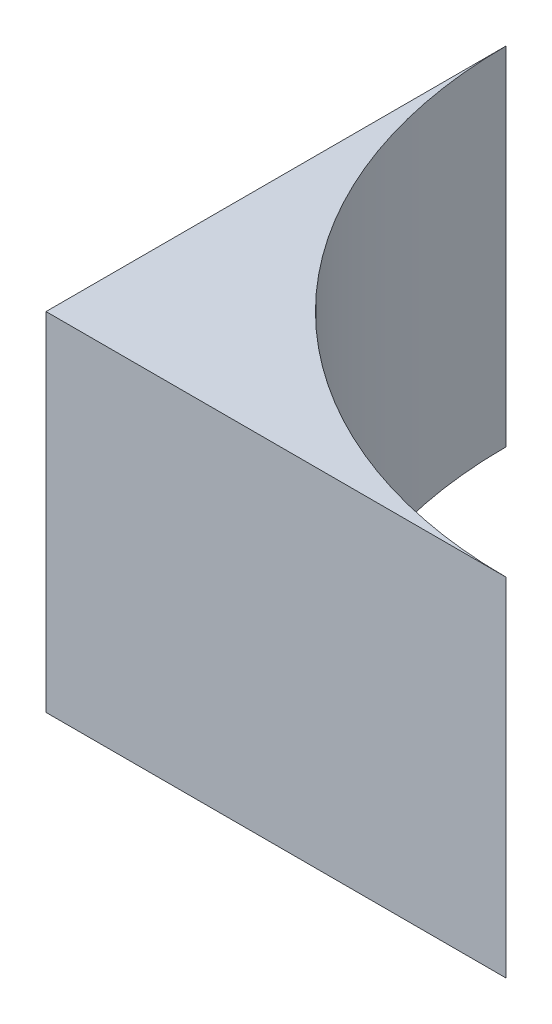
ISO-10303-21;
HEADER;
FILE_DESCRIPTION(('STEP AP214'),'2;1');
FILE_NAME('part.step','',(''),(''),'','','');
FILE_SCHEMA(('AUTOMOTIVE_DESIGN { 1 0 10303 214 1 1 1 1 }'));
ENDSEC;
DATA;
#1=APPLICATION_CONTEXT('core data for automotive mechanical design processes');
#2=APPLICATION_PROTOCOL_DEFINITION('international standard','automotive_design',2000,#1);
#3=PRODUCT_CONTEXT('',#1,'mechanical');
#4=PRODUCT('Part','Part','',(#3));
#5=PRODUCT_RELATED_PRODUCT_CATEGORY('part','',(#4));
#6=PRODUCT_DEFINITION_FORMATION('','',#4);
#7=PRODUCT_DEFINITION_CONTEXT('part definition',#1,'design');
#8=PRODUCT_DEFINITION('design','',#6,#7);
#9=PRODUCT_DEFINITION_SHAPE('','',#8);
#10=(LENGTH_UNIT() NAMED_UNIT(*) SI_UNIT(.MILLI.,.METRE.));
#11=(NAMED_UNIT(*) PLANE_ANGLE_UNIT() SI_UNIT($,.RADIAN.));
#12=(NAMED_UNIT(*) SI_UNIT($,.STERADIAN.) SOLID_ANGLE_UNIT());
#13=UNCERTAINTY_MEASURE_WITH_UNIT(LENGTH_MEASURE(1.E-05),#10,'distance_accuracy_value','');
#14=(GEOMETRIC_REPRESENTATION_CONTEXT(3) GLOBAL_UNCERTAINTY_ASSIGNED_CONTEXT((#13)) GLOBAL_UNIT_ASSIGNED_CONTEXT((#10,
#11,#12)) REPRESENTATION_CONTEXT('',''));
#15=CARTESIAN_POINT('',(0.,0.,0.));
#16=DIRECTION('',(0.,0.,1.));
#17=DIRECTION('',(1.,0.,0.));
#18=AXIS2_PLACEMENT_3D('',#15,#16,#17);
#19=CARTESIAN_POINT('',(0.,48.5,0.));
#20=DIRECTION('',(0.,-1.,0.));
#21=DIRECTION('',(0.,0.,-1.));
#22=AXIS2_PLACEMENT_3D('',#19,#20,#21);
#23=CYLINDRICAL_SURFACE('',#22,64.25);
#24=CARTESIAN_POINT('',(0.,0.,0.));
#25=DIRECTION('',(0.,-1.,0.));
#26=DIRECTION('',(0.,0.,1.));
#27=AXIS2_PLACEMENT_3D('',#24,#25,#26);
#28=CIRCLE('',#27,64.25);
#29=CARTESIAN_POINT('',(0.,0.,64.25));
#30=VERTEX_POINT('',#29);
#31=CARTESIAN_POINT('',(-64.25,0.,0.));
#32=VERTEX_POINT('',#31);
#33=EDGE_CURVE('E86',#30,#32,#28,.T.);
#34=ORIENTED_EDGE('',*,*,#33,.T.);
#35=DIRECTION('',(0.,-1.,0.));
#36=VECTOR('',#35,1.);
#37=CARTESIAN_POINT('',(-64.25,48.5,0.));
#38=LINE('',#37,#36);
#39=CARTESIAN_POINT('',(-64.25,48.5,0.));
#40=VERTEX_POINT('',#39);
#41=EDGE_CURVE('E11',#40,#32,#38,.T.);
#42=ORIENTED_EDGE('',*,*,#41,.F.);
#43=CARTESIAN_POINT('',(0.,48.5,0.));
#44=DIRECTION('',(0.,-1.,0.));
#45=DIRECTION('',(0.,0.,1.));
#46=AXIS2_PLACEMENT_3D('',#43,#44,#45);
#47=CIRCLE('',#46,64.25);
#48=CARTESIAN_POINT('',(0.,48.5,64.25));
#49=VERTEX_POINT('',#48);
#50=EDGE_CURVE('E79',#49,#40,#47,.T.);
#51=ORIENTED_EDGE('',*,*,#50,.F.);
#52=DIRECTION('',(0.,-1.,0.));
#53=VECTOR('',#52,1.);
#54=CARTESIAN_POINT('',(0.,48.5,64.25));
#55=LINE('',#54,#53);
#56=EDGE_CURVE('E87',#49,#30,#55,.T.);
#57=ORIENTED_EDGE('',*,*,#56,.T.);
#58=EDGE_LOOP('',(#34,#42,#51,#57));
#59=FACE_BOUND('',#58,.T.);
#60=ADVANCED_FACE('F39',(#59),#23,.F.);
#61=CARTESIAN_POINT('',(-64.25,48.5,64.25));
#62=DIRECTION('',(1.,0.,0.));
#63=DIRECTION('',(0.,0.,-1.));
#64=AXIS2_PLACEMENT_3D('',#61,#62,#63);
#65=PLANE('',#64);
#66=DIRECTION('',(0.,0.,1.));
#67=VECTOR('',#66,1.);
#68=CARTESIAN_POINT('',(-64.25,0.,64.25));
#69=LINE('',#68,#67);
#70=CARTESIAN_POINT('',(-64.25,0.,64.25));
#71=VERTEX_POINT('',#70);
#72=EDGE_CURVE('E67',#32,#71,#69,.T.);
#73=ORIENTED_EDGE('',*,*,#72,.T.);
#74=DIRECTION('',(0.,-1.,0.));
#75=VECTOR('',#74,1.);
#76=CARTESIAN_POINT('',(-64.25,48.5,64.25));
#77=LINE('',#76,#75);
#78=CARTESIAN_POINT('',(-64.25,48.5,64.25));
#79=VERTEX_POINT('',#78);
#80=EDGE_CURVE('E47',#79,#71,#77,.T.);
#81=ORIENTED_EDGE('',*,*,#80,.F.);
#82=DIRECTION('',(0.,0.,1.));
#83=VECTOR('',#82,1.);
#84=CARTESIAN_POINT('',(-64.25,48.5,64.25));
#85=LINE('',#84,#83);
#86=EDGE_CURVE('E75',#40,#79,#85,.T.);
#87=ORIENTED_EDGE('',*,*,#86,.F.);
#88=ORIENTED_EDGE('',*,*,#41,.T.);
#89=EDGE_LOOP('',(#73,#81,#87,#88));
#90=FACE_BOUND('',#89,.T.);
#91=ADVANCED_FACE('F76',(#90),#65,.F.);
#92=CARTESIAN_POINT('',(0.,48.5,64.25));
#93=DIRECTION('',(0.,0.,-1.));
#94=DIRECTION('',(-1.,0.,0.));
#95=AXIS2_PLACEMENT_3D('',#92,#93,#94);
#96=PLANE('',#95);
#97=DIRECTION('',(1.,0.,0.));
#98=VECTOR('',#97,1.);
#99=CARTESIAN_POINT('',(0.,0.,64.25));
#100=LINE('',#99,#98);
#101=EDGE_CURVE('E72',#71,#30,#100,.T.);
#102=ORIENTED_EDGE('',*,*,#101,.T.);
#103=ORIENTED_EDGE('',*,*,#56,.F.);
#104=DIRECTION('',(1.,0.,0.));
#105=VECTOR('',#104,1.);
#106=CARTESIAN_POINT('',(0.,48.5,64.25));
#107=LINE('',#106,#105);
#108=EDGE_CURVE('E55',#79,#49,#107,.T.);
#109=ORIENTED_EDGE('',*,*,#108,.F.);
#110=ORIENTED_EDGE('',*,*,#80,.T.);
#111=EDGE_LOOP('',(#102,#103,#109,#110));
#112=FACE_BOUND('',#111,.T.);
#113=ADVANCED_FACE('F94',(#112),#96,.F.);
#114=CARTESIAN_POINT('',(0.,48.5,0.));
#115=DIRECTION('',(0.,1.,0.));
#116=DIRECTION('',(0.,0.,1.));
#117=AXIS2_PLACEMENT_3D('',#114,#115,#116);
#118=PLANE('',#117);
#119=ORIENTED_EDGE('',*,*,#50,.T.);
#120=ORIENTED_EDGE('',*,*,#86,.T.);
#121=ORIENTED_EDGE('',*,*,#108,.T.);
#122=EDGE_LOOP('',(#119,#120,#121));
#123=FACE_BOUND('',#122,.T.);
#124=ADVANCED_FACE('F82',(#123),#118,.T.);
#125=CARTESIAN_POINT('',(0.,0.,0.));
#126=DIRECTION('',(0.,1.,0.));
#127=DIRECTION('',(0.,0.,1.));
#128=AXIS2_PLACEMENT_3D('',#125,#126,#127);
#129=PLANE('',#128);
#130=ORIENTED_EDGE('',*,*,#33,.F.);
#131=ORIENTED_EDGE('',*,*,#101,.F.);
#132=ORIENTED_EDGE('',*,*,#72,.F.);
#133=EDGE_LOOP('',(#130,#131,#132));
#134=FACE_BOUND('',#133,.T.);
#135=ADVANCED_FACE('F95',(#134),#129,.F.);
#136=CLOSED_SHELL('',(#60,#91,#113,#124,#135));
#137=MANIFOLD_SOLID_BREP('B2',#136);
#138=ADVANCED_BREP_SHAPE_REPRESENTATION('',(#18,#137),#14);
#139=SHAPE_DEFINITION_REPRESENTATION(#9,#138);
ENDSEC;
END-ISO-10303-21;
